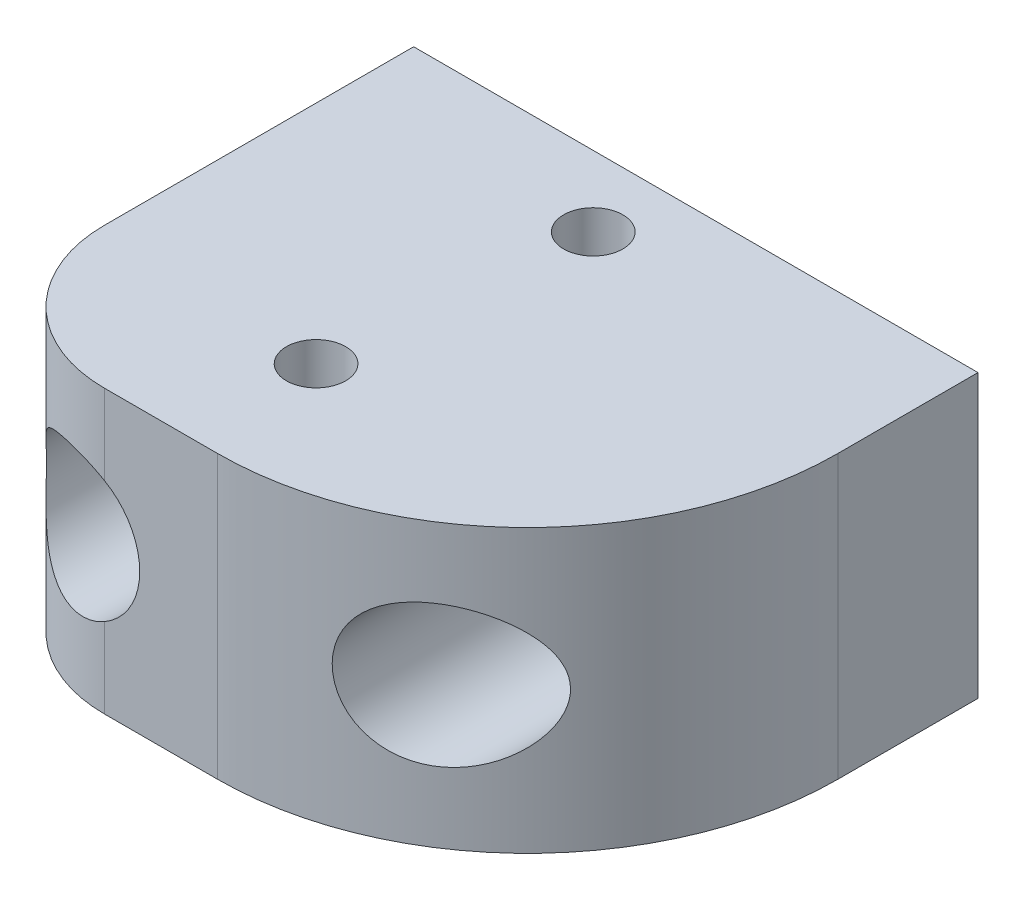
ISO-10303-21;
HEADER;
FILE_DESCRIPTION(('STEP AP214'),'2;1');
FILE_NAME('part.step','',(''),(''),'','','');
FILE_SCHEMA(('AUTOMOTIVE_DESIGN { 1 0 10303 214 1 1 1 1 }'));
ENDSEC;
DATA;
#1=APPLICATION_CONTEXT('core data for automotive mechanical design processes');
#2=APPLICATION_PROTOCOL_DEFINITION('international standard','automotive_design',2000,#1);
#3=PRODUCT_CONTEXT('',#1,'mechanical');
#4=PRODUCT('Part','Part','',(#3));
#5=PRODUCT_RELATED_PRODUCT_CATEGORY('part','',(#4));
#6=PRODUCT_DEFINITION_FORMATION('','',#4);
#7=PRODUCT_DEFINITION_CONTEXT('part definition',#1,'design');
#8=PRODUCT_DEFINITION('design','',#6,#7);
#9=PRODUCT_DEFINITION_SHAPE('','',#8);
#10=(LENGTH_UNIT() NAMED_UNIT(*) SI_UNIT(.MILLI.,.METRE.));
#11=(NAMED_UNIT(*) PLANE_ANGLE_UNIT() SI_UNIT($,.RADIAN.));
#12=(NAMED_UNIT(*) SI_UNIT($,.STERADIAN.) SOLID_ANGLE_UNIT());
#13=UNCERTAINTY_MEASURE_WITH_UNIT(LENGTH_MEASURE(1.E-05),#10,'distance_accuracy_value','');
#14=(GEOMETRIC_REPRESENTATION_CONTEXT(3) GLOBAL_UNCERTAINTY_ASSIGNED_CONTEXT((#13)) GLOBAL_UNIT_ASSIGNED_CONTEXT((#10,
#11,#12)) REPRESENTATION_CONTEXT('',''));
#15=CARTESIAN_POINT('',(0.,0.,0.));
#16=DIRECTION('',(0.,0.,1.));
#17=DIRECTION('',(1.,0.,0.));
#18=AXIS2_PLACEMENT_3D('',#15,#16,#17);
#19=CARTESIAN_POINT('',(-17.73,-20.,-5.));
#20=DIRECTION('',(-1.,0.,0.));
#21=DIRECTION('',(0.,0.,1.));
#22=AXIS2_PLACEMENT_3D('',#19,#20,#21);
#23=PLANE('',#22);
#24=DIRECTION('',(0.,0.,1.));
#25=VECTOR('',#24,1.);
#26=CARTESIAN_POINT('',(-17.73,-20.,-5.));
#27=LINE('',#26,#25);
#28=CARTESIAN_POINT('',(-17.73,-20.,-5.));
#29=VERTEX_POINT('',#28);
#30=CARTESIAN_POINT('',(-17.73,-20.,16.9166710077514));
#31=VERTEX_POINT('',#30);
#32=EDGE_CURVE('E121',#29,#31,#27,.T.);
#33=ORIENTED_EDGE('',*,*,#32,.T.);
#34=DIRECTION('',(0.,1.,0.));
#35=VECTOR('',#34,1.);
#36=CARTESIAN_POINT('',(-17.73,-20.,16.9166710077514));
#37=LINE('',#36,#35);
#38=CARTESIAN_POINT('',(-17.73,0.,16.9166710077514));
#39=VERTEX_POINT('',#38);
#40=EDGE_CURVE('E143',#31,#39,#37,.T.);
#41=ORIENTED_EDGE('',*,*,#40,.T.);
#42=DIRECTION('',(0.,0.,1.));
#43=VECTOR('',#42,1.);
#44=CARTESIAN_POINT('',(-17.73,0.,-5.));
#45=LINE('',#44,#43);
#46=CARTESIAN_POINT('',(-17.73,0.,-5.));
#47=VERTEX_POINT('',#46);
#48=EDGE_CURVE('E125',#47,#39,#45,.T.);
#49=ORIENTED_EDGE('',*,*,#48,.F.);
#50=DIRECTION('',(0.,1.,0.));
#51=VECTOR('',#50,1.);
#52=CARTESIAN_POINT('',(-17.73,-20.,-5.));
#53=LINE('',#52,#51);
#54=EDGE_CURVE('E116',#29,#47,#53,.T.);
#55=ORIENTED_EDGE('',*,*,#54,.F.);
#56=EDGE_LOOP('',(#33,#41,#49,#55));
#57=FACE_BOUND('',#56,.T.);
#58=ADVANCED_FACE('F37',(#57),#23,.T.);
#59=CARTESIAN_POINT('',(-17.73,-20.,-5.));
#60=DIRECTION('',(0.,0.,-1.));
#61=DIRECTION('',(-1.,0.,0.));
#62=AXIS2_PLACEMENT_3D('',#59,#60,#61);
#63=PLANE('',#62);
#64=CARTESIAN_POINT('',(-10.23,-10.,-5.));
#65=DIRECTION('',(0.,0.,-1.));
#66=DIRECTION('',(-1.,0.,0.));
#67=AXIS2_PLACEMENT_3D('',#64,#65,#66);
#68=CIRCLE('',#67,2.74999999999999);
#69=CARTESIAN_POINT('',(-12.98,-10.,-5.));
#70=VERTEX_POINT('',#69);
#71=EDGE_CURVE('E152',#70,#70,#68,.T.);
#72=ORIENTED_EDGE('',*,*,#71,.F.);
#73=EDGE_LOOP('',(#72));
#74=FACE_BOUND('',#73,.T.);
#75=CARTESIAN_POINT('',(12.27,-10.,-5.));
#76=DIRECTION('',(0.,0.,-1.));
#77=DIRECTION('',(-1.,0.,0.));
#78=AXIS2_PLACEMENT_3D('',#75,#76,#77);
#79=CIRCLE('',#78,2.74999999999999);
#80=CARTESIAN_POINT('',(9.52000000000001,-10.,-5.));
#81=VERTEX_POINT('',#80);
#82=EDGE_CURVE('E129',#81,#81,#79,.T.);
#83=ORIENTED_EDGE('',*,*,#82,.F.);
#84=EDGE_LOOP('',(#83));
#85=FACE_BOUND('',#84,.T.);
#86=DIRECTION('',(-1.,0.,0.));
#87=VECTOR('',#86,1.);
#88=CARTESIAN_POINT('',(-17.73,0.,-5.));
#89=LINE('',#88,#87);
#90=CARTESIAN_POINT('',(22.27,0.,-5.));
#91=VERTEX_POINT('',#90);
#92=EDGE_CURVE('E115',#91,#47,#89,.T.);
#93=ORIENTED_EDGE('',*,*,#92,.F.);
#94=DIRECTION('',(0.,1.,0.));
#95=VECTOR('',#94,1.);
#96=CARTESIAN_POINT('',(22.27,-20.,-5.));
#97=LINE('',#96,#95);
#98=CARTESIAN_POINT('',(22.27,-20.,-5.));
#99=VERTEX_POINT('',#98);
#100=EDGE_CURVE('E100',#99,#91,#97,.T.);
#101=ORIENTED_EDGE('',*,*,#100,.F.);
#102=DIRECTION('',(-1.,0.,0.));
#103=VECTOR('',#102,1.);
#104=CARTESIAN_POINT('',(-17.73,-20.,-5.));
#105=LINE('',#104,#103);
#106=EDGE_CURVE('E108',#99,#29,#105,.T.);
#107=ORIENTED_EDGE('',*,*,#106,.T.);
#108=ORIENTED_EDGE('',*,*,#54,.T.);
#109=EDGE_LOOP('',(#93,#101,#107,#108));
#110=FACE_BOUND('',#109,.T.);
#111=ADVANCED_FACE('F113',(#74,#85,#110),#63,.T.);
#112=CARTESIAN_POINT('',(22.27,-20.,-5.));
#113=DIRECTION('',(1.,0.,0.));
#114=DIRECTION('',(0.,0.,-1.));
#115=AXIS2_PLACEMENT_3D('',#112,#113,#114);
#116=PLANE('',#115);
#117=DIRECTION('',(0.,0.,-1.));
#118=VECTOR('',#117,1.);
#119=CARTESIAN_POINT('',(22.27,0.,-5.));
#120=LINE('',#119,#118);
#121=CARTESIAN_POINT('',(22.27,0.,4.91667100775141));
#122=VERTEX_POINT('',#121);
#123=EDGE_CURVE('E131',#122,#91,#120,.T.);
#124=ORIENTED_EDGE('',*,*,#123,.F.);
#125=DIRECTION('',(0.,1.,0.));
#126=VECTOR('',#125,1.);
#127=CARTESIAN_POINT('',(22.27,-20.,4.91667100775141));
#128=LINE('',#127,#126);
#129=CARTESIAN_POINT('',(22.27,-20.,4.91667100775141));
#130=VERTEX_POINT('',#129);
#131=EDGE_CURVE('E103',#122,#130,#128,.F.);
#132=ORIENTED_EDGE('',*,*,#131,.T.);
#133=DIRECTION('',(0.,0.,-1.));
#134=VECTOR('',#133,1.);
#135=CARTESIAN_POINT('',(22.27,-20.,-5.));
#136=LINE('',#135,#134);
#137=EDGE_CURVE('E96',#130,#99,#136,.T.);
#138=ORIENTED_EDGE('',*,*,#137,.T.);
#139=ORIENTED_EDGE('',*,*,#100,.T.);
#140=EDGE_LOOP('',(#124,#132,#138,#139));
#141=FACE_BOUND('',#140,.T.);
#142=ADVANCED_FACE('F99',(#141),#116,.T.);
#143=CARTESIAN_POINT('',(-17.73,-20.,26.9166710077514));
#144=DIRECTION('',(0.,0.,1.));
#145=DIRECTION('',(1.,0.,0.));
#146=AXIS2_PLACEMENT_3D('',#143,#144,#145);
#147=PLANE('',#146);
#148=DIRECTION('',(1.,0.,0.));
#149=VECTOR('',#148,1.);
#150=CARTESIAN_POINT('',(-17.73,0.,26.9166710077514));
#151=LINE('',#150,#149);
#152=CARTESIAN_POINT('',(-7.73,0.,26.9166710077514));
#153=VERTEX_POINT('',#152);
#154=CARTESIAN_POINT('',(0.270000000000003,0.,26.9166710077514));
#155=VERTEX_POINT('',#154);
#156=EDGE_CURVE('E128',#153,#155,#151,.T.);
#157=ORIENTED_EDGE('',*,*,#156,.F.);
#158=DIRECTION('',(0.,1.,0.));
#159=VECTOR('',#158,1.);
#160=CARTESIAN_POINT('',(-7.73,-20.,26.9166710077514));
#161=LINE('',#160,#159);
#162=CARTESIAN_POINT('',(-7.73,-5.66987298107781,26.9166710077514));
#163=VERTEX_POINT('',#162);
#164=EDGE_CURVE('E201',#153,#163,#161,.F.);
#165=ORIENTED_EDGE('',*,*,#164,.T.);
#166=CARTESIAN_POINT('',(-10.23,-10.,26.9166710077514));
#167=DIRECTION('',(0.,0.,1.));
#168=DIRECTION('',(1.,0.,0.));
#169=AXIS2_PLACEMENT_3D('',#166,#167,#168);
#170=CIRCLE('',#169,5.);
#171=CARTESIAN_POINT('',(-7.73,-14.3301270189222,26.9166710077514));
#172=VERTEX_POINT('',#171);
#173=EDGE_CURVE('E230',#172,#163,#170,.T.);
#174=ORIENTED_EDGE('',*,*,#173,.F.);
#175=DIRECTION('',(0.,1.,0.));
#176=VECTOR('',#175,1.);
#177=CARTESIAN_POINT('',(-7.73,-20.,26.9166710077514));
#178=LINE('',#177,#176);
#179=CARTESIAN_POINT('',(-7.73,-20.,26.9166710077514));
#180=VERTEX_POINT('',#179);
#181=EDGE_CURVE('E53',#172,#180,#178,.F.);
#182=ORIENTED_EDGE('',*,*,#181,.T.);
#183=DIRECTION('',(1.,0.,0.));
#184=VECTOR('',#183,1.);
#185=CARTESIAN_POINT('',(-17.73,-20.,26.9166710077514));
#186=LINE('',#185,#184);
#187=CARTESIAN_POINT('',(0.270000000000003,-20.,26.9166710077514));
#188=VERTEX_POINT('',#187);
#189=EDGE_CURVE('E109',#180,#188,#186,.T.);
#190=ORIENTED_EDGE('',*,*,#189,.T.);
#191=DIRECTION('',(0.,1.,0.));
#192=VECTOR('',#191,1.);
#193=CARTESIAN_POINT('',(0.270000000000003,-20.,26.9166710077514));
#194=LINE('',#193,#192);
#195=EDGE_CURVE('E134',#188,#155,#194,.T.);
#196=ORIENTED_EDGE('',*,*,#195,.T.);
#197=EDGE_LOOP('',(#157,#165,#174,#182,#190,#196));
#198=FACE_BOUND('',#197,.T.);
#199=ADVANCED_FACE('F176',(#198),#147,.T.);
#200=CARTESIAN_POINT('',(0.,-20.,0.));
#201=DIRECTION('',(0.,1.,0.));
#202=DIRECTION('',(0.,0.,1.));
#203=AXIS2_PLACEMENT_3D('',#200,#201,#202);
#204=PLANE('',#203);
#205=CARTESIAN_POINT('',(-1.73,-20.,17.9166710077514));
#206=DIRECTION('',(0.,1.,0.));
#207=DIRECTION('',(0.,0.,1.));
#208=AXIS2_PLACEMENT_3D('',#205,#206,#207);
#209=CIRCLE('',#208,2.1);
#210=CARTESIAN_POINT('',(-1.73,-20.,20.0166710077514));
#211=VERTEX_POINT('',#210);
#212=EDGE_CURVE('E265',#211,#211,#209,.T.);
#213=ORIENTED_EDGE('',*,*,#212,.T.);
#214=EDGE_LOOP('',(#213));
#215=FACE_BOUND('',#214,.T.);
#216=CARTESIAN_POINT('',(0.,-20.,0.));
#217=DIRECTION('',(0.,1.,0.));
#218=DIRECTION('',(0.,0.,1.));
#219=AXIS2_PLACEMENT_3D('',#216,#217,#218);
#220=CIRCLE('',#219,2.1);
#221=CARTESIAN_POINT('',(0.,-20.,2.1));
#222=VERTEX_POINT('',#221);
#223=EDGE_CURVE('E233',#222,#222,#220,.T.);
#224=ORIENTED_EDGE('',*,*,#223,.T.);
#225=EDGE_LOOP('',(#224));
#226=FACE_BOUND('',#225,.T.);
#227=ORIENTED_EDGE('',*,*,#189,.F.);
#228=CARTESIAN_POINT('',(-7.73,-20.,16.9166710077514));
#229=DIRECTION('',(0.,1.,0.));
#230=DIRECTION('',(0.,0.,1.));
#231=AXIS2_PLACEMENT_3D('',#228,#229,#230);
#232=CIRCLE('',#231,10.);
#233=EDGE_CURVE('E11',#180,#31,#232,.F.);
#234=ORIENTED_EDGE('',*,*,#233,.T.);
#235=ORIENTED_EDGE('',*,*,#32,.F.);
#236=ORIENTED_EDGE('',*,*,#106,.F.);
#237=ORIENTED_EDGE('',*,*,#137,.F.);
#238=CARTESIAN_POINT('',(0.269999999999999,-20.,4.91667100775141));
#239=DIRECTION('',(0.,1.,0.));
#240=DIRECTION('',(0.,0.,1.));
#241=AXIS2_PLACEMENT_3D('',#238,#239,#240);
#242=CIRCLE('',#241,22.);
#243=EDGE_CURVE('E141',#130,#188,#242,.F.);
#244=ORIENTED_EDGE('',*,*,#243,.T.);
#245=EDGE_LOOP('',(#227,#234,#235,#236,#237,#244));
#246=FACE_BOUND('',#245,.T.);
#247=ADVANCED_FACE('F119',(#215,#226,#246),#204,.F.);
#248=CARTESIAN_POINT('',(0.,0.,0.));
#249=DIRECTION('',(0.,1.,0.));
#250=DIRECTION('',(0.,0.,1.));
#251=AXIS2_PLACEMENT_3D('',#248,#249,#250);
#252=PLANE('',#251);
#253=CARTESIAN_POINT('',(-1.73,0.,17.9166710077514));
#254=DIRECTION('',(0.,1.,0.));
#255=DIRECTION('',(0.,0.,1.));
#256=AXIS2_PLACEMENT_3D('',#253,#254,#255);
#257=CIRCLE('',#256,2.1);
#258=CARTESIAN_POINT('',(-1.73,0.,20.0166710077514));
#259=VERTEX_POINT('',#258);
#260=EDGE_CURVE('E268',#259,#259,#257,.T.);
#261=ORIENTED_EDGE('',*,*,#260,.F.);
#262=EDGE_LOOP('',(#261));
#263=FACE_BOUND('',#262,.T.);
#264=CARTESIAN_POINT('',(0.,0.,0.));
#265=DIRECTION('',(0.,1.,0.));
#266=DIRECTION('',(0.,0.,1.));
#267=AXIS2_PLACEMENT_3D('',#264,#265,#266);
#268=CIRCLE('',#267,2.1);
#269=CARTESIAN_POINT('',(0.,0.,2.1));
#270=VERTEX_POINT('',#269);
#271=EDGE_CURVE('E270',#270,#270,#268,.T.);
#272=ORIENTED_EDGE('',*,*,#271,.F.);
#273=EDGE_LOOP('',(#272));
#274=FACE_BOUND('',#273,.T.);
#275=ORIENTED_EDGE('',*,*,#48,.T.);
#276=CARTESIAN_POINT('',(-7.73,0.,16.9166710077514));
#277=DIRECTION('',(0.,1.,0.));
#278=DIRECTION('',(0.,0.,1.));
#279=AXIS2_PLACEMENT_3D('',#276,#277,#278);
#280=CIRCLE('',#279,10.);
#281=EDGE_CURVE('E198',#39,#153,#280,.T.);
#282=ORIENTED_EDGE('',*,*,#281,.T.);
#283=ORIENTED_EDGE('',*,*,#156,.T.);
#284=CARTESIAN_POINT('',(0.269999999999999,0.,4.91667100775141));
#285=DIRECTION('',(0.,1.,0.));
#286=DIRECTION('',(0.,0.,1.));
#287=AXIS2_PLACEMENT_3D('',#284,#285,#286);
#288=CIRCLE('',#287,22.);
#289=EDGE_CURVE('E138',#155,#122,#288,.T.);
#290=ORIENTED_EDGE('',*,*,#289,.T.);
#291=ORIENTED_EDGE('',*,*,#123,.T.);
#292=ORIENTED_EDGE('',*,*,#92,.T.);
#293=EDGE_LOOP('',(#275,#282,#283,#290,#291,#292));
#294=FACE_BOUND('',#293,.T.);
#295=ADVANCED_FACE('F172',(#263,#274,#294),#252,.T.);
#296=CARTESIAN_POINT('',(12.27,-10.,26.9166710077514));
#297=DIRECTION('',(0.,0.,1.));
#298=DIRECTION('',(1.,0.,0.));
#299=AXIS2_PLACEMENT_3D('',#296,#297,#298);
#300=CYLINDRICAL_SURFACE('',#299,2.74999999999999);
#301=CARTESIAN_POINT('',(12.27,-10.,1.91667100775141));
#302=DIRECTION('',(0.,0.,1.));
#303=DIRECTION('',(1.,0.,0.));
#304=AXIS2_PLACEMENT_3D('',#301,#302,#303);
#305=CIRCLE('',#304,2.75);
#306=CARTESIAN_POINT('',(15.02,-10.,1.91667100775141));
#307=VERTEX_POINT('',#306);
#308=EDGE_CURVE('E241',#307,#307,#305,.T.);
#309=ORIENTED_EDGE('',*,*,#308,.T.);
#310=EDGE_LOOP('',(#309));
#311=FACE_BOUND('',#310,.T.);
#312=ORIENTED_EDGE('',*,*,#82,.T.);
#313=EDGE_LOOP('',(#312));
#314=FACE_BOUND('',#313,.T.);
#315=ADVANCED_FACE('F168',(#311,#314),#300,.F.);
#316=CARTESIAN_POINT('',(15.02,-10.,1.91667100775141));
#317=DIRECTION('',(0.,0.,-1.));
#318=DIRECTION('',(-1.,0.,0.));
#319=AXIS2_PLACEMENT_3D('',#316,#317,#318);
#320=PLANE('',#319);
#321=ORIENTED_EDGE('',*,*,#308,.F.);
#322=EDGE_LOOP('',(#321));
#323=FACE_BOUND('',#322,.T.);
#324=CARTESIAN_POINT('',(12.27,-10.,1.91667100775141));
#325=DIRECTION('',(0.,0.,1.));
#326=DIRECTION('',(1.,0.,0.));
#327=AXIS2_PLACEMENT_3D('',#324,#325,#326);
#328=CIRCLE('',#327,4.99999999999999);
#329=CARTESIAN_POINT('',(17.27,-10.,1.91667100775141));
#330=VERTEX_POINT('',#329);
#331=EDGE_CURVE('E151',#330,#330,#328,.T.);
#332=ORIENTED_EDGE('',*,*,#331,.T.);
#333=EDGE_LOOP('',(#332));
#334=FACE_BOUND('',#333,.T.);
#335=ADVANCED_FACE('F163',(#323,#334),#320,.F.);
#336=CARTESIAN_POINT('',(12.27,-10.,26.9166710077514));
#337=DIRECTION('',(0.,0.,1.));
#338=DIRECTION('',(1.,0.,0.));
#339=AXIS2_PLACEMENT_3D('',#336,#337,#338);
#340=CYLINDRICAL_SURFACE('',#339,5.);
#341=ORIENTED_EDGE('',*,*,#331,.F.);
#342=EDGE_LOOP('',(#341));
#343=FACE_BOUND('',#342,.T.);
#344=CARTESIAN_POINT('',(7.27,-10.,25.7733246223656));
#345=CARTESIAN_POINT('',(7.2700007223581,-10.1338416377949,25.7733246345114));
#346=CARTESIAN_POINT('',(7.27537935408155,-10.2677024487158,25.7715215632899));
#347=CARTESIAN_POINT('',(7.29685031757656,-10.5345161557332,25.7642967628733));
#348=CARTESIAN_POINT('',(7.31294764588359,-10.6674685991789,25.7588733460459));
#349=CARTESIAN_POINT('',(7.35574326607018,-10.931673960956,25.7443629951599));
#350=CARTESIAN_POINT('',(7.38245839658989,-11.0629238361359,25.7352702415925));
#351=CARTESIAN_POINT('',(7.4462492446893,-11.3226160873273,25.7133674468182));
#352=CARTESIAN_POINT('',(7.48332887496663,-11.4510573832908,25.7005560016995));
#353=CARTESIAN_POINT('',(7.56742515992619,-11.703972102994,25.6711781029299));
#354=CARTESIAN_POINT('',(7.61442590458345,-11.8284515167487,25.6546176583279));
#355=CARTESIAN_POINT('',(7.71797173703601,-12.072837861437,25.6176549902578));
#356=CARTESIAN_POINT('',(7.77452032412567,-12.1927430961052,25.5972513579393));
#357=CARTESIAN_POINT('',(7.8965575365797,-12.427020977961,25.5525581106075));
#358=CARTESIAN_POINT('',(7.96203841466335,-12.5413983045251,25.5282718600162));
#359=CARTESIAN_POINT('',(8.10137967767707,-12.7640290265552,25.4757331417843));
#360=CARTESIAN_POINT('',(8.17524316979033,-12.8722801287853,25.4474792025132));
#361=CARTESIAN_POINT('',(8.33136500518425,-13.0829375247456,25.386685048035));
#362=CARTESIAN_POINT('',(8.41369603537542,-13.1852789723184,25.3541068765291));
#363=CARTESIAN_POINT('',(8.58541003965682,-13.3824389582317,25.284845380853));
#364=CARTESIAN_POINT('',(8.67479555168581,-13.4772547642962,25.248160577266));
#365=CARTESIAN_POINT('',(8.85973702515186,-13.6588104112574,25.1707190430437));
#366=CARTESIAN_POINT('',(8.9552915174985,-13.745552162995,25.1299632806171));
#367=CARTESIAN_POINT('',(9.15175935727465,-13.9106326282104,25.0444090088815));
#368=CARTESIAN_POINT('',(9.25267470579353,-13.9889681704128,24.9996089855128));
#369=CARTESIAN_POINT('',(9.463250626606,-14.1400035669387,24.9041180933616));
#370=CARTESIAN_POINT('',(9.5731003343656,-14.2123342909734,24.8532598512667));
#371=CARTESIAN_POINT('',(9.79666851902596,-14.3473800680601,24.7474029812153));
#372=CARTESIAN_POINT('',(9.91038839174459,-14.4100916059618,24.6924028505786));
#373=CARTESIAN_POINT('',(10.255883627366,-14.5836273747759,24.5214630267395));
#374=CARTESIAN_POINT('',(10.4921364436606,-14.6799530370848,24.3995202925183));
#375=CARTESIAN_POINT('',(10.9907980933303,-14.8413327827428,24.1299985494947));
#376=CARTESIAN_POINT('',(11.253640955203,-14.9027733746899,23.9810986048003));
#377=CARTESIAN_POINT('',(11.777607421221,-14.9827548664532,23.6694848037276));
#378=CARTESIAN_POINT('',(12.0387302150365,-15.0012768131228,23.5067648772267));
#379=CARTESIAN_POINT('',(12.5905881660225,-14.9983929737155,23.1464992859396));
#380=CARTESIAN_POINT('',(12.8802024969914,-14.9708830474155,22.9473050903013));
#381=CARTESIAN_POINT('',(13.4442206081505,-14.8686207174098,22.53941720395));
#382=CARTESIAN_POINT('',(13.718611486988,-14.7938288895766,22.3307157208497));
#383=CARTESIAN_POINT('',(14.1370842694732,-14.6412125632803,21.9971546704095));
#384=CARTESIAN_POINT('',(14.2877088830102,-14.5777129067139,21.8736994929455));
#385=CARTESIAN_POINT('',(14.5817094278112,-14.4365057002835,21.6263034529144));
#386=CARTESIAN_POINT('',(14.7250870136802,-14.3588014124248,21.5023627082364));
#387=CARTESIAN_POINT('',(15.0040570867746,-14.1894606052709,21.2550414308402));
#388=CARTESIAN_POINT('',(15.1396447018715,-14.0978154947982,21.1316612922227));
#389=CARTESIAN_POINT('',(15.4022655316383,-13.9007514737264,20.8868540543205));
#390=CARTESIAN_POINT('',(15.5293007115334,-13.795335743898,20.7654265112726));
#391=CARTESIAN_POINT('',(15.7501065553796,-13.5925903130844,20.5494969004145));
#392=CARTESIAN_POINT('',(15.8455222095337,-13.4977146734561,20.4543755329324));
#393=CARTESIAN_POINT('',(16.029791972489,-13.2988407667801,20.2674446762473));
#394=CARTESIAN_POINT('',(16.1186458000242,-13.194842109101,20.1756353290968));
#395=CARTESIAN_POINT('',(16.3742067728247,-12.8690757582377,19.9071674922042));
#396=CARTESIAN_POINT('',(16.530425883495,-12.6330752454342,19.7369624034048));
#397=CARTESIAN_POINT('',(16.7638796000408,-12.2011981966392,19.4759528137183));
#398=CARTESIAN_POINT('',(16.8506066739904,-12.0154435808214,19.3768616324052));
#399=CARTESIAN_POINT('',(17.0029143935069,-11.6257548310234,19.200337364769));
#400=CARTESIAN_POINT('',(17.0685286140063,-11.4218502262209,19.1228699173435));
#401=CARTESIAN_POINT('',(17.1648648425426,-11.0357039401573,19.0080941222104));
#402=CARTESIAN_POINT('',(17.1996766131976,-10.8558870695868,18.9661379641903));
#403=CARTESIAN_POINT('',(17.2493876344703,-10.4896410396729,18.9060228880103));
#404=CARTESIAN_POINT('',(17.2643048697536,-10.3032180090503,18.8878424768576));
#405=CARTESIAN_POINT('',(17.2730061949525,-9.92866903598775,18.8772528035197));
#406=CARTESIAN_POINT('',(17.2667393871567,-9.74054007684447,18.8849056092936));
#407=CARTESIAN_POINT('',(17.233521653201,-9.36884209076685,18.9252244635268));
#408=CARTESIAN_POINT('',(17.2065556261834,-9.18527649395725,18.9579087733686));
#409=CARTESIAN_POINT('',(17.1267945687878,-8.79195511510633,19.0536089118612));
#410=CARTESIAN_POINT('',(17.0699502491072,-8.58418668630999,19.1213402137617));
#411=CARTESIAN_POINT('',(16.9340318171628,-8.18579098919997,19.2805492665961));
#412=CARTESIAN_POINT('',(16.8549169086032,-7.99519603391857,19.3720705733764));
#413=CARTESIAN_POINT('',(16.6406800459454,-7.55454999625988,19.6148589395774));
#414=CARTESIAN_POINT('',(16.4960790649578,-7.31396035405529,19.7749328895081));
#415=CARTESIAN_POINT('',(16.2576705390265,-6.98052779076284,20.0298508420801));
#416=CARTESIAN_POINT('',(16.174488592596,-6.87383248849702,20.1174206471357));
#417=CARTESIAN_POINT('',(16.0015175218113,-6.66927889379313,20.2963582052144));
#418=CARTESIAN_POINT('',(15.9117284889905,-6.57142047897233,20.3877259056145));
#419=CARTESIAN_POINT('',(15.6950438232676,-6.35308064567912,20.6042038037776));
#420=CARTESIAN_POINT('',(15.5657878367498,-6.23599109567088,20.7303714084134));
#421=CARTESIAN_POINT('',(15.2975072069061,-6.01701337106865,20.9855328898034));
#422=CARTESIAN_POINT('',(15.1584795991334,-5.91512983910588,21.1145276159913));
#423=CARTESIAN_POINT('',(14.8714112688417,-5.72657498412819,21.3737732359006));
#424=CARTESIAN_POINT('',(14.7233659807266,-5.63991145459058,21.5040247373584));
#425=CARTESIAN_POINT('',(14.4190704711949,-5.48216205846069,21.7643382743151));
#426=CARTESIAN_POINT('',(14.2628211389189,-5.41107450807184,21.8944003287821));
#427=CARTESIAN_POINT('',(13.9416387234881,-5.28453214577597,22.1541088331941));
#428=CARTESIAN_POINT('',(13.7766492485867,-5.22919871676465,22.2837448304527));
#429=CARTESIAN_POINT('',(13.4399175885742,-5.1356577987833,22.5404643046515));
#430=CARTESIAN_POINT('',(13.2681748029742,-5.09745183651073,22.6675475530823));
#431=CARTESIAN_POINT('',(12.9192437021379,-5.03918097313434,22.9178562786822));
#432=CARTESIAN_POINT('',(12.7420633193242,-5.0190908344466,23.0410868911359));
#433=CARTESIAN_POINT('',(12.383365257974,-4.99806020379587,23.2827566513955));
#434=CARTESIAN_POINT('',(12.201848848708,-4.99711417497974,23.4011971746987));
#435=CARTESIAN_POINT('',(11.877156805844,-5.01343304789726,23.6062963840925));
#436=CARTESIAN_POINT('',(11.7345097526134,-5.02666238708918,23.6941267999908));
#437=CARTESIAN_POINT('',(11.4485481778415,-5.06582994328227,23.8657566361873));
#438=CARTESIAN_POINT('',(11.3052337969133,-5.09176559318236,23.9495568669641));
#439=CARTESIAN_POINT('',(11.0190100763857,-5.15680247063785,24.1126579918406));
#440=CARTESIAN_POINT('',(10.8761007506317,-5.19590414288467,24.1919587338613));
#441=CARTESIAN_POINT('',(10.5920187783842,-5.28760751418766,24.3455666858758));
#442=CARTESIAN_POINT('',(10.4508453036461,-5.34020249054863,24.4198763593462));
#443=CARTESIAN_POINT('',(10.1705570096301,-5.45954787475286,24.563654447769));
#444=CARTESIAN_POINT('',(10.031464567329,-5.52639824700305,24.6330838125889));
#445=CARTESIAN_POINT('',(9.75803386827053,-5.67401455268513,24.7661122943338));
#446=CARTESIAN_POINT('',(9.62369339913116,-5.75477390491168,24.8297141469122));
#447=CARTESIAN_POINT('',(9.36139288249929,-5.93000309247735,24.9508279214353));
#448=CARTESIAN_POINT('',(9.23343137795313,-6.02446977739288,25.008341237499));
#449=CARTESIAN_POINT('',(8.98557245736251,-6.22665885389451,25.1170945855175));
#450=CARTESIAN_POINT('',(8.86567390411901,-6.33437937006982,25.1683355029714));
#451=CARTESIAN_POINT('',(8.64925703111039,-6.54882567634927,25.2587490650659));
#452=CARTESIAN_POINT('',(8.55165154467039,-6.6541579441073,25.2986322659667));
#453=CARTESIAN_POINT('',(8.36511777361582,-6.87387527796672,25.3734343464395));
#454=CARTESIAN_POINT('',(8.27618864289189,-6.98825945936047,25.408353710232));
#455=CARTESIAN_POINT('',(8.10802241211897,-7.22528163335798,25.4732644700515));
#456=CARTESIAN_POINT('',(8.02878662477304,-7.34792074039127,25.5032551988157));
#457=CARTESIAN_POINT('',(7.88095343361543,-7.60048413125645,25.5583670444635));
#458=CARTESIAN_POINT('',(7.81235522175978,-7.73040786071719,25.5834885312571));
#459=CARTESIAN_POINT('',(7.69131683025692,-7.98649768541278,25.6272451813892));
#460=CARTESIAN_POINT('',(7.63805094243598,-8.11221553023552,25.6462253812712));
#461=CARTESIAN_POINT('',(7.54184472299259,-8.36806191728683,25.6801697264149));
#462=CARTESIAN_POINT('',(7.49890365113237,-8.49819014254946,25.695134159596));
#463=CARTESIAN_POINT('',(7.42385030637397,-8.76163128267701,25.7210936215728));
#464=CARTESIAN_POINT('',(7.39171651805565,-8.89493729736217,25.7320965401734));
#465=CARTESIAN_POINT('',(7.33849033318564,-9.16393973172884,25.7502314115817));
#466=CARTESIAN_POINT('',(7.31739258048876,-9.2996349587322,25.7573652422448));
#467=CARTESIAN_POINT('',(7.29128801497072,-9.52957594968855,25.7661705813969));
#468=CARTESIAN_POINT('',(7.28330876780739,-9.62345732629991,25.7688539033731));
#469=CARTESIAN_POINT('',(7.27266448842463,-9.81155596613761,25.7724309255162));
#470=CARTESIAN_POINT('',(7.26999949144773,-9.90577323158733,25.7733246138148));
#471=CARTESIAN_POINT('',(7.27,-10.,25.7733246223656));
#472=B_SPLINE_CURVE_WITH_KNOTS('',3,(#344,#345,#346,#347,#348,#349,#350,#351,#352,#353,#354,
#355,#356,#357,#358,#359,#360,#361,#362,#363,#364,#365,#366,#367,#368,#369,#370,#371,#372,#373,
#374,#375,#376,#377,#378,#379,#380,#381,#382,#383,#384,#385,#386,#387,#388,#389,#390,#391,#392,
#393,#394,#395,#396,#397,#398,#399,#400,#401,#402,#403,#404,#405,#406,#407,#408,#409,#410,#411,
#412,#413,#414,#415,#416,#417,#418,#419,#420,#421,#422,#423,#424,#425,#426,#427,#428,#429,#430,
#431,#432,#433,#434,#435,#436,#437,#438,#439,#440,#441,#442,#443,#444,#445,#446,#447,#448,#449,
#450,#451,#452,#453,#454,#455,#456,#457,#458,#459,#460,#461,#462,#463,#464,#465,#466,#467,#468,
#469,#470,#471),.UNSPECIFIED.,.T.,.F.,(4,2,2,2,2,2,2,2,2,2,2,2,2,2,2,2,2,2,2,2,2,2,2,2,2,2,2,2,
2,2,2,2,2,2,2,2,2,2,2,2,2,2,2,2,2,2,2,2,2,2,2,2,2,2,2,2,2,2,2,2,2,2,2,4),(0.,0.401438218002498,
0.803063698120877,1.20532866895366,1.60774570422765,2.00952223945553,2.41144634711874,
2.81302404291324,3.21475108069094,3.6202716703274,4.02593882203518,4.43150972137594,
4.83723308998168,5.25980520303556,5.68253137108333,6.52743482742032,7.44870630967427,
8.37038455379623,9.42418309498474,10.4788614650583,11.0928571173236,11.7067119460263,
12.3209466133146,12.9350396532494,13.4289688674359,13.9229192411208,14.9082732384412,
15.5892771770974,16.2691927276659,16.8305173620821,17.3913342141363,17.953499466146,
18.5160752290554,19.1897561738509,19.8646793204692,20.8284351796893,21.3116301922636,
21.7948185120071,22.4397444729632,23.0848669386912,23.7303187854648,24.3757008230548,
25.02592858551,25.6762142960441,26.3255926721932,26.9747832326577,27.4784170698203,
27.9819491979842,28.4854983349964,28.9887970770419,29.4957485701788,30.002460848677,
30.509056850931,31.0155812523536,31.4621081389488,31.9085914370815,32.3551351326114,
32.8016448914725,33.2146876581231,33.6277008028325,34.0398867746146,34.4518725131641,
34.7344899091645,35.0171091793926),.UNSPECIFIED.);
#473=CARTESIAN_POINT('',(7.27,-10.,25.7733246223656));
#474=VERTEX_POINT('',#473);
#475=EDGE_CURVE('E144',#474,#474,#472,.T.);
#476=ORIENTED_EDGE('',*,*,#475,.T.);
#477=EDGE_LOOP('',(#476));
#478=FACE_BOUND('',#477,.T.);
#479=ADVANCED_FACE('F157',(#343,#478),#340,.F.);
#480=CARTESIAN_POINT('',(-10.23,-10.,26.9166710077514));
#481=DIRECTION('',(0.,0.,1.));
#482=DIRECTION('',(1.,0.,0.));
#483=AXIS2_PLACEMENT_3D('',#480,#481,#482);
#484=CYLINDRICAL_SURFACE('',#483,2.74999999999999);
#485=CARTESIAN_POINT('',(-10.23,-10.,1.91667100775141));
#486=DIRECTION('',(0.,0.,1.));
#487=DIRECTION('',(1.,0.,0.));
#488=AXIS2_PLACEMENT_3D('',#485,#486,#487);
#489=CIRCLE('',#488,2.74999999999999);
#490=CARTESIAN_POINT('',(-7.48000000000001,-10.,1.91667100775141));
#491=VERTEX_POINT('',#490);
#492=EDGE_CURVE('E226',#491,#491,#489,.T.);
#493=ORIENTED_EDGE('',*,*,#492,.T.);
#494=EDGE_LOOP('',(#493));
#495=FACE_BOUND('',#494,.T.);
#496=ORIENTED_EDGE('',*,*,#71,.T.);
#497=EDGE_LOOP('',(#496));
#498=FACE_BOUND('',#497,.T.);
#499=ADVANCED_FACE('F162',(#495,#498),#484,.F.);
#500=CARTESIAN_POINT('',(-7.48000000000001,-10.,1.91667100775141));
#501=DIRECTION('',(0.,0.,-1.));
#502=DIRECTION('',(-1.,0.,0.));
#503=AXIS2_PLACEMENT_3D('',#500,#501,#502);
#504=PLANE('',#503);
#505=ORIENTED_EDGE('',*,*,#492,.F.);
#506=EDGE_LOOP('',(#505));
#507=FACE_BOUND('',#506,.T.);
#508=CARTESIAN_POINT('',(-10.23,-10.,1.91667100775141));
#509=DIRECTION('',(0.,0.,1.));
#510=DIRECTION('',(1.,0.,0.));
#511=AXIS2_PLACEMENT_3D('',#508,#509,#510);
#512=CIRCLE('',#511,5.);
#513=CARTESIAN_POINT('',(-5.23000000000001,-10.,1.91667100775141));
#514=VERTEX_POINT('',#513);
#515=EDGE_CURVE('E229',#514,#514,#512,.T.);
#516=ORIENTED_EDGE('',*,*,#515,.T.);
#517=EDGE_LOOP('',(#516));
#518=FACE_BOUND('',#517,.T.);
#519=ADVANCED_FACE('F214',(#507,#518),#504,.F.);
#520=CARTESIAN_POINT('',(-10.23,-10.,26.9166710077514));
#521=DIRECTION('',(0.,0.,1.));
#522=DIRECTION('',(1.,0.,0.));
#523=AXIS2_PLACEMENT_3D('',#520,#521,#522);
#524=CYLINDRICAL_SURFACE('',#523,5.);
#525=ORIENTED_EDGE('',*,*,#515,.F.);
#526=EDGE_LOOP('',(#525));
#527=FACE_BOUND('',#526,.T.);
#528=ORIENTED_EDGE('',*,*,#173,.T.);
#529=CARTESIAN_POINT('',(-7.73,-5.66987298107781,26.9166710077514));
#530=CARTESIAN_POINT('',(-7.84176134452195,-5.60532502442525,26.9166865487287));
#531=CARTESIAN_POINT('',(-7.95604977365433,-5.54513235779345,26.9147981108663));
#532=CARTESIAN_POINT('',(-8.18882231749847,-5.43379946145685,26.9068142205338));
#533=CARTESIAN_POINT('',(-8.30730678234001,-5.38265998932369,26.9007184161999));
#534=CARTESIAN_POINT('',(-8.54731569642314,-5.28989379219326,26.8839400503641));
#535=CARTESIAN_POINT('',(-8.6688324701543,-5.24824531159916,26.8732681436825));
#536=CARTESIAN_POINT('',(-8.9142174578981,-5.17453388671308,26.8470711063274));
#537=CARTESIAN_POINT('',(-9.03808549213836,-5.14247021270171,26.8315463453001));
#538=CARTESIAN_POINT('',(-9.28733674283498,-5.08800688270649,26.7954652499511));
#539=CARTESIAN_POINT('',(-9.41272134585256,-5.0656168863374,26.7749039183263));
#540=CARTESIAN_POINT('',(-9.66395732420913,-5.03052416369024,26.7287109829262));
#541=CARTESIAN_POINT('',(-9.78980885642246,-5.01782505941562,26.703077487916));
#542=CARTESIAN_POINT('',(-10.0409297098716,-5.00199307593952,26.6468381097797));
#543=CARTESIAN_POINT('',(-10.1661992921496,-4.99885538747494,26.6162347345982));
#544=CARTESIAN_POINT('',(-10.4153941053073,-5.00188388733386,26.5502208707207));
#545=CARTESIAN_POINT('',(-10.5393188017112,-5.00805364734256,26.5148085413595));
#546=CARTESIAN_POINT('',(-10.7861041818783,-5.02946452171326,26.4391196166061));
#547=CARTESIAN_POINT('',(-10.9089452816377,-5.04478669686777,26.3988021497358));
#548=CARTESIAN_POINT('',(-11.1517438801548,-5.08415488877451,26.3139175730014));
#549=CARTESIAN_POINT('',(-11.271700329603,-5.10820403032374,26.2693489451761));
#550=CARTESIAN_POINT('',(-11.6263333065,-5.19279170040281,26.1298652790422));
#551=CARTESIAN_POINT('',(-11.8558756890493,-5.26577994500872,26.0291407882447));
#552=CARTESIAN_POINT('',(-12.3233680137378,-5.45154612218635,25.8035248687929));
#553=CARTESIAN_POINT('',(-12.5591315826534,-5.56799420305699,25.6771843976692));
#554=CARTESIAN_POINT('',(-13.0062870759083,-5.83347682913514,25.4153729447052));
#555=CARTESIAN_POINT('',(-13.2176538999816,-5.98254448604713,25.2798927826523));
#556=CARTESIAN_POINT('',(-13.5312519363243,-6.24178069610752,25.0631600206113));
#557=CARTESIAN_POINT('',(-13.6422755510105,-6.34229633666372,24.9828204497212));
#558=CARTESIAN_POINT('',(-13.8550466806765,-6.55305055375128,24.8224617572929));
#559=CARTESIAN_POINT('',(-13.9567921098943,-6.66329130561012,24.7424427116562));
#560=CARTESIAN_POINT('',(-14.1505410200419,-6.89323944257364,24.5842838502139));
#561=CARTESIAN_POINT('',(-14.2425464859554,-7.01294489007287,24.5061436540213));
#562=CARTESIAN_POINT('',(-14.4162649539029,-7.26171747965846,24.3535544258065));
#563=CARTESIAN_POINT('',(-14.4979818339776,-7.39078106533256,24.2791040094634));
#564=CARTESIAN_POINT('',(-14.6829737848427,-7.71542052494554,24.1054342558871));
#565=CARTESIAN_POINT('',(-14.7805976560311,-7.91590386575545,24.0091786147172));
#566=CARTESIAN_POINT('',(-14.9501378714081,-8.33530118862454,23.8365189216734));
#567=CARTESIAN_POINT('',(-15.0221075489429,-8.55417575126664,23.7600737765655));
#568=CARTESIAN_POINT('',(-15.1252324407046,-8.96440345264651,23.648328993728));
#569=CARTESIAN_POINT('',(-15.1615547614043,-9.15304073206376,23.6079619869936));
#570=CARTESIAN_POINT('',(-15.2122402498578,-9.53674222281947,23.5512465374093));
#571=CARTESIAN_POINT('',(-15.2266281302149,-9.73179894803808,23.5348710651277));
#572=CARTESIAN_POINT('',(-15.2323199692082,-10.123159524612,23.5284201555529));
#573=CARTESIAN_POINT('',(-15.223570546883,-10.3194652156923,23.5384055363076));
#574=CARTESIAN_POINT('',(-15.1836193564957,-10.7068939957186,23.5833341952623));
#575=CARTESIAN_POINT('',(-15.1523946309681,-10.8980115779526,23.6183029925764));
#576=CARTESIAN_POINT('',(-15.0592724781651,-11.3172270394187,23.7201686889639));
#577=CARTESIAN_POINT('',(-14.991654031157,-11.5426080435344,23.7928662731282));
#578=CARTESIAN_POINT('',(-14.8293246430899,-11.9747886310335,23.9603281530815));
#579=CARTESIAN_POINT('',(-14.7345502261838,-12.1815431699585,24.0551440517709));
#580=CARTESIAN_POINT('',(-14.554722070777,-12.5140717985285,24.2264938249301));
#581=CARTESIAN_POINT('',(-14.4757853984555,-12.6450588830114,24.2995646037496));
#582=CARTESIAN_POINT('',(-14.3075234570408,-12.8977319033377,24.4498573637709));
#583=CARTESIAN_POINT('',(-14.2181944824055,-13.0194144957269,24.527080820366));
#584=CARTESIAN_POINT('',(-14.0296886971296,-13.253453715576,24.6838437038386));
#585=CARTESIAN_POINT('',(-13.9305042453254,-13.3658029808336,24.7633848934012));
#586=CARTESIAN_POINT('',(-13.7227707722582,-13.5809080771307,24.9231600901947));
#587=CARTESIAN_POINT('',(-13.614222839395,-13.6836650202867,25.0033940159297));
#588=CARTESIAN_POINT('',(-13.38606781992,-13.8810296314905,25.1646257637264));
#589=CARTESIAN_POINT('',(-13.2662977963919,-13.9754589020342,25.2456116228136));
#590=CARTESIAN_POINT('',(-13.0177426353985,-14.1535356883356,25.4055824770488));
#591=CARTESIAN_POINT('',(-12.8889580043127,-14.2371838089565,25.4845675842465));
#592=CARTESIAN_POINT('',(-12.6229235973898,-14.3929084470016,25.6392248677267));
#593=CARTESIAN_POINT('',(-12.4856835571066,-14.4649979406706,25.714900688732));
#594=CARTESIAN_POINT('',(-12.2031601068025,-14.5968385879769,25.8618469929369));
#595=CARTESIAN_POINT('',(-12.0578785130791,-14.6565925134709,25.9331184632862));
#596=CARTESIAN_POINT('',(-11.7871871339352,-14.7530918909671,26.0576342300483));
#597=CARTESIAN_POINT('',(-11.6629834286529,-14.7920459875391,26.1117961684715));
#598=CARTESIAN_POINT('',(-11.4102497575524,-14.8604672767275,26.2158336261203));
#599=CARTESIAN_POINT('',(-11.2817205551809,-14.889936133882,26.2657098962984));
#600=CARTESIAN_POINT('',(-11.0210800997684,-14.9388016158783,26.3606116383334));
#601=CARTESIAN_POINT('',(-10.8889708756118,-14.9582038251179,26.4056397886376));
#602=CARTESIAN_POINT('',(-10.6219400535009,-14.986422171832,26.4904008009903));
#603=CARTESIAN_POINT('',(-10.4870184545969,-14.9952383057317,26.5301336612507));
#604=CARTESIAN_POINT('',(-10.2146229400482,-15.0018417649242,26.6041201468942));
#605=CARTESIAN_POINT('',(-10.0771392009489,-14.9995695281858,26.6383431588904));
#606=CARTESIAN_POINT('',(-9.80148714005857,-14.9835164009827,26.700786235199));
#607=CARTESIAN_POINT('',(-9.66331887398395,-14.969736432364,26.7290067801217));
#608=CARTESIAN_POINT('',(-9.38753331044676,-14.9304808599491,26.7793391893988));
#609=CARTESIAN_POINT('',(-9.24991597071138,-14.905006171543,26.8014515316484));
#610=CARTESIAN_POINT('',(-8.97657835228226,-14.842375650443,26.8396291016732));
#611=CARTESIAN_POINT('',(-8.84085750176571,-14.8052234217207,26.8556961918027));
#612=CARTESIAN_POINT('',(-8.53718908614255,-14.7080785940925,26.8854917777521));
#613=CARTESIAN_POINT('',(-8.37014812652066,-14.6446492197826,26.8974953790575));
#614=CARTESIAN_POINT('',(-8.12536948145669,-14.5363536222385,26.9091871237901));
#615=CARTESIAN_POINT('',(-8.04477916040252,-14.498085530063,26.9120322481838));
#616=CARTESIAN_POINT('',(-7.88573391784884,-14.4172803192709,26.9157744374543));
#617=CARTESIAN_POINT('',(-7.80727872238929,-14.3747437516608,26.916671753431));
#618=CARTESIAN_POINT('',(-7.73,-14.3301270189222,26.9166710077514));
#619=B_SPLINE_CURVE_WITH_KNOTS('',3,(#529,#530,#531,#532,#533,#534,#535,#536,#537,#538,#539,
#540,#541,#542,#543,#544,#545,#546,#547,#548,#549,#550,#551,#552,#553,#554,#555,#556,#557,#558,
#559,#560,#561,#562,#563,#564,#565,#566,#567,#568,#569,#570,#571,#572,#573,#574,#575,#576,#577,
#578,#579,#580,#581,#582,#583,#584,#585,#586,#587,#588,#589,#590,#591,#592,#593,#594,#595,#596,
#597,#598,#599,#600,#601,#602,#603,#604,#605,#606,#607,#608,#609,#610,#611,#612,#613,#614,#615,
#616,#617,#618),.UNSPECIFIED.,.F.,.F.,(4,2,2,2,2,2,2,2,2,2,2,2,2,2,2,2,2,2,2,2,2,2,2,2,2,2,2,2,
2,2,2,2,2,2,2,2,2,2,2,2,2,2,2,2,4),(0.,0.387090916849163,0.774214210184111,1.16044099361338,
1.54663836497324,1.93322048598693,2.31994702269687,2.70647900904469,3.09315936277964,
3.48331631629536,3.87361310834647,4.65388774477209,5.52593271215405,6.39886702154285,
6.90827243696635,7.41779208728215,7.92720769785387,8.43643071765022,9.16263926913818,
9.88732915359625,10.4737624782751,11.0595346038483,11.6466593652476,12.2343846995965,
12.9692127756451,13.705772690227,14.2136590620487,14.7217270871772,15.2301921484635,
15.7385981858229,16.2560875413462,16.7735478511137,17.2904231059819,17.8071820899648,
18.2297277077615,18.6521991337308,19.0744359455757,19.4966729000116,19.9211804212367,
20.3456539398449,20.7700942389636,21.1944036739409,21.730247477374,21.9979024822545,
22.2655229805749),.UNSPECIFIED.);
#620=EDGE_CURVE('E46',#163,#172,#619,.T.);
#621=ORIENTED_EDGE('',*,*,#620,.T.);
#622=EDGE_LOOP('',(#528,#621));
#623=FACE_BOUND('',#622,.T.);
#624=ADVANCED_FACE('F209',(#527,#623),#524,.F.);
#625=CARTESIAN_POINT('',(0.,0.,0.));
#626=DIRECTION('',(0.,1.,0.));
#627=DIRECTION('',(0.,0.,1.));
#628=AXIS2_PLACEMENT_3D('',#625,#626,#627);
#629=CYLINDRICAL_SURFACE('',#628,2.1);
#630=ORIENTED_EDGE('',*,*,#223,.F.);
#631=EDGE_LOOP('',(#630));
#632=FACE_BOUND('',#631,.T.);
#633=ORIENTED_EDGE('',*,*,#271,.T.);
#634=EDGE_LOOP('',(#633));
#635=FACE_BOUND('',#634,.T.);
#636=ADVANCED_FACE('F213',(#632,#635),#629,.F.);
#637=CARTESIAN_POINT('',(-1.73,0.,17.9166710077514));
#638=DIRECTION('',(0.,1.,0.));
#639=DIRECTION('',(0.,0.,1.));
#640=AXIS2_PLACEMENT_3D('',#637,#638,#639);
#641=CYLINDRICAL_SURFACE('',#640,2.1);
#642=ORIENTED_EDGE('',*,*,#212,.F.);
#643=EDGE_LOOP('',(#642));
#644=FACE_BOUND('',#643,.T.);
#645=ORIENTED_EDGE('',*,*,#260,.T.);
#646=EDGE_LOOP('',(#645));
#647=FACE_BOUND('',#646,.T.);
#648=ADVANCED_FACE('F250',(#644,#647),#641,.F.);
#649=CARTESIAN_POINT('',(0.269999999999999,-20.,4.91667100775141));
#650=DIRECTION('',(0.,1.,0.));
#651=DIRECTION('',(0.,0.,1.));
#652=AXIS2_PLACEMENT_3D('',#649,#650,#651);
#653=CYLINDRICAL_SURFACE('',#652,22.);
#654=ORIENTED_EDGE('',*,*,#243,.F.);
#655=ORIENTED_EDGE('',*,*,#131,.F.);
#656=ORIENTED_EDGE('',*,*,#289,.F.);
#657=ORIENTED_EDGE('',*,*,#195,.F.);
#658=EDGE_LOOP('',(#654,#655,#656,#657));
#659=FACE_BOUND('',#658,.T.);
#660=ORIENTED_EDGE('',*,*,#475,.F.);
#661=EDGE_LOOP('',(#660));
#662=FACE_BOUND('',#661,.T.);
#663=ADVANCED_FACE('F154',(#659,#662),#653,.T.);
#664=CARTESIAN_POINT('',(-7.73,-20.,16.9166710077514));
#665=DIRECTION('',(0.,1.,0.));
#666=DIRECTION('',(0.,0.,1.));
#667=AXIS2_PLACEMENT_3D('',#664,#665,#666);
#668=CYLINDRICAL_SURFACE('',#667,10.);
#669=ORIENTED_EDGE('',*,*,#620,.F.);
#670=ORIENTED_EDGE('',*,*,#164,.F.);
#671=ORIENTED_EDGE('',*,*,#281,.F.);
#672=ORIENTED_EDGE('',*,*,#40,.F.);
#673=ORIENTED_EDGE('',*,*,#233,.F.);
#674=ORIENTED_EDGE('',*,*,#181,.F.);
#675=EDGE_LOOP('',(#669,#670,#671,#672,#673,#674));
#676=FACE_BOUND('',#675,.T.);
#677=ADVANCED_FACE('F39',(#676),#668,.T.);
#678=CLOSED_SHELL('',(#58,#111,#142,#199,#247,#295,#315,#335,#479,#499,#519,#624,#636,#648,#663,#677));
#679=MANIFOLD_SOLID_BREP('B2',#678);
#680=ADVANCED_BREP_SHAPE_REPRESENTATION('',(#18,#679),#14);
#681=SHAPE_DEFINITION_REPRESENTATION(#9,#680);
ENDSEC;
END-ISO-10303-21;
